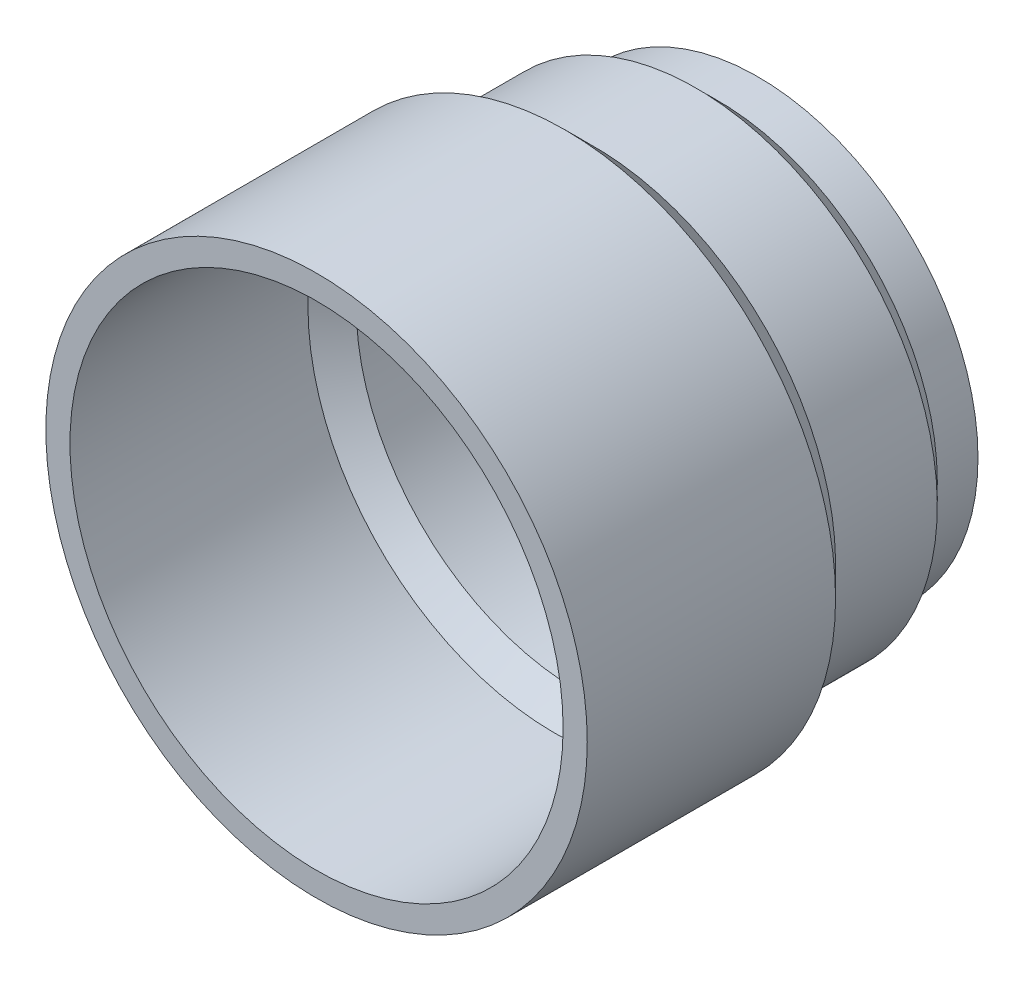
ISO-10303-21;
HEADER;
FILE_DESCRIPTION(('STEP AP214'),'2;1');
FILE_NAME('part.step','',(''),(''),'','','');
FILE_SCHEMA(('AUTOMOTIVE_DESIGN { 1 0 10303 214 1 1 1 1 }'));
ENDSEC;
DATA;
#1=APPLICATION_CONTEXT('core data for automotive mechanical design processes');
#2=APPLICATION_PROTOCOL_DEFINITION('international standard','automotive_design',2000,#1);
#3=PRODUCT_CONTEXT('',#1,'mechanical');
#4=PRODUCT('Part','Part','',(#3));
#5=PRODUCT_RELATED_PRODUCT_CATEGORY('part','',(#4));
#6=PRODUCT_DEFINITION_FORMATION('','',#4);
#7=PRODUCT_DEFINITION_CONTEXT('part definition',#1,'design');
#8=PRODUCT_DEFINITION('design','',#6,#7);
#9=PRODUCT_DEFINITION_SHAPE('','',#8);
#10=(LENGTH_UNIT() NAMED_UNIT(*) SI_UNIT(.MILLI.,.METRE.));
#11=(NAMED_UNIT(*) PLANE_ANGLE_UNIT() SI_UNIT($,.RADIAN.));
#12=(NAMED_UNIT(*) SI_UNIT($,.STERADIAN.) SOLID_ANGLE_UNIT());
#13=UNCERTAINTY_MEASURE_WITH_UNIT(LENGTH_MEASURE(1.E-05),#10,'distance_accuracy_value','');
#14=(GEOMETRIC_REPRESENTATION_CONTEXT(3) GLOBAL_UNCERTAINTY_ASSIGNED_CONTEXT((#13)) GLOBAL_UNIT_ASSIGNED_CONTEXT((#10,
#11,#12)) REPRESENTATION_CONTEXT('',''));
#15=CARTESIAN_POINT('',(0.,0.,0.));
#16=DIRECTION('',(0.,0.,1.));
#17=DIRECTION('',(1.,0.,0.));
#18=AXIS2_PLACEMENT_3D('',#15,#16,#17);
#19=CARTESIAN_POINT('',(0.,125.,67.3934));
#20=DIRECTION('',(0.,0.,1.));
#21=DIRECTION('',(1.,0.,0.));
#22=AXIS2_PLACEMENT_3D('',#19,#20,#21);
#23=CYLINDRICAL_SURFACE('',#22,3.50000000000002);
#24=CARTESIAN_POINT('',(0.,125.,67.393399999999));
#25=DIRECTION('',(0.,0.,1.));
#26=DIRECTION('',(0.,-1.,0.));
#27=AXIS2_PLACEMENT_3D('',#24,#25,#26);
#28=CIRCLE('',#27,3.49999999997096);
#29=CARTESIAN_POINT('',(0.,121.500000000029,67.393399999999));
#30=VERTEX_POINT('',#29);
#31=EDGE_CURVE('E41',#30,#30,#28,.T.);
#32=ORIENTED_EDGE('',*,*,#31,.T.);
#33=EDGE_LOOP('',(#32));
#34=FACE_BOUND('',#33,.T.);
#35=CARTESIAN_POINT('',(0.,125.,68.8684000000011));
#36=DIRECTION('',(0.,0.,1.));
#37=DIRECTION('',(0.,-1.,0.));
#38=AXIS2_PLACEMENT_3D('',#35,#36,#37);
#39=CIRCLE('',#38,3.50000000002962);
#40=CARTESIAN_POINT('',(0.,121.49999999997,68.8684000000011));
#41=VERTEX_POINT('',#40);
#42=EDGE_CURVE('E38',#41,#41,#39,.F.);
#43=ORIENTED_EDGE('',*,*,#42,.T.);
#44=EDGE_LOOP('',(#43));
#45=FACE_BOUND('',#44,.T.);
#46=ADVANCED_FACE('F14',(#34,#45),#23,.T.);
#47=CARTESIAN_POINT('',(0.,125.,67.0834000000011));
#48=DIRECTION('',(0.,0.,1.));
#49=DIRECTION('',(1.,0.,0.));
#50=AXIS2_PLACEMENT_3D('',#47,#48,#49);
#51=CONICAL_SURFACE('',#50,3.19000000002911,0.785398163307064);
#52=ORIENTED_EDGE('',*,*,#31,.F.);
#53=EDGE_LOOP('',(#52));
#54=FACE_BOUND('',#53,.T.);
#55=CARTESIAN_POINT('',(0.,125.,67.083399999997));
#56=DIRECTION('',(0.,0.,1.));
#57=DIRECTION('',(0.,-1.,0.));
#58=AXIS2_PLACEMENT_3D('',#55,#56,#57);
#59=CIRCLE('',#58,3.19);
#60=CARTESIAN_POINT('',(0.,121.81,67.083399999997));
#61=VERTEX_POINT('',#60);
#62=EDGE_CURVE('E35',#61,#61,#59,.T.);
#63=ORIENTED_EDGE('',*,*,#62,.T.);
#64=EDGE_LOOP('',(#63));
#65=FACE_BOUND('',#64,.T.);
#66=ADVANCED_FACE('F108',(#54,#65),#51,.T.);
#67=CARTESIAN_POINT('',(0.,125.,68.8684000000011));
#68=DIRECTION('',(0.,0.,1.));
#69=DIRECTION('',(1.,0.,0.));
#70=AXIS2_PLACEMENT_3D('',#67,#68,#69);
#71=CONICAL_SURFACE('',#70,3.50000000002962,0.785398163330296);
#72=ORIENTED_EDGE('',*,*,#42,.F.);
#73=EDGE_LOOP('',(#72));
#74=FACE_BOUND('',#73,.T.);
#75=CARTESIAN_POINT('',(0.,125.,69.2934));
#76=DIRECTION('',(0.,0.,1.));
#77=DIRECTION('',(0.,-1.,0.));
#78=AXIS2_PLACEMENT_3D('',#75,#76,#77);
#79=CIRCLE('',#78,3.925);
#80=CARTESIAN_POINT('',(0.,121.075,69.2934));
#81=VERTEX_POINT('',#80);
#82=EDGE_CURVE('E32',#81,#81,#79,.F.);
#83=ORIENTED_EDGE('',*,*,#82,.T.);
#84=EDGE_LOOP('',(#83));
#85=FACE_BOUND('',#84,.T.);
#86=ADVANCED_FACE('F104',(#74,#85),#71,.T.);
#87=CARTESIAN_POINT('',(0.,125.,66.493400000003));
#88=DIRECTION('',(0.,0.,1.));
#89=DIRECTION('',(1.,0.,0.));
#90=AXIS2_PLACEMENT_3D('',#87,#88,#89);
#91=CYLINDRICAL_SURFACE('',#90,3.19);
#92=ORIENTED_EDGE('',*,*,#62,.F.);
#93=EDGE_LOOP('',(#92));
#94=FACE_BOUND('',#93,.T.);
#95=CARTESIAN_POINT('',(0.,125.,66.493400000003));
#96=DIRECTION('',(0.,0.,1.));
#97=DIRECTION('',(1.,0.,0.));
#98=AXIS2_PLACEMENT_3D('',#95,#96,#97);
#99=CIRCLE('',#98,3.19);
#100=CARTESIAN_POINT('',(3.19,125.,66.493400000003));
#101=VERTEX_POINT('',#100);
#102=EDGE_CURVE('E18',#101,#101,#99,.T.);
#103=ORIENTED_EDGE('',*,*,#102,.T.);
#104=EDGE_LOOP('',(#103));
#105=FACE_BOUND('',#104,.T.);
#106=ADVANCED_FACE('F61',(#94,#105),#91,.T.);
#107=CARTESIAN_POINT('',(0.,125.,69.2934));
#108=DIRECTION('',(0.,0.,1.));
#109=DIRECTION('',(1.,0.,0.));
#110=AXIS2_PLACEMENT_3D('',#107,#108,#109);
#111=CYLINDRICAL_SURFACE('',#110,3.925);
#112=ORIENTED_EDGE('',*,*,#82,.F.);
#113=EDGE_LOOP('',(#112));
#114=FACE_BOUND('',#113,.T.);
#115=CARTESIAN_POINT('',(0.,125.,72.8933999999999));
#116=DIRECTION('',(0.,0.,1.));
#117=DIRECTION('',(1.,0.,0.));
#118=AXIS2_PLACEMENT_3D('',#115,#116,#117);
#119=CIRCLE('',#118,3.925);
#120=CARTESIAN_POINT('',(3.925,125.,72.8933999999999));
#121=VERTEX_POINT('',#120);
#122=EDGE_CURVE('E54',#121,#121,#119,.T.);
#123=ORIENTED_EDGE('',*,*,#122,.F.);
#124=EDGE_LOOP('',(#123));
#125=FACE_BOUND('',#124,.T.);
#126=ADVANCED_FACE('F66',(#114,#125),#111,.T.);
#127=CARTESIAN_POINT('',(-3.319885096314,128.3176,66.4934));
#128=DIRECTION('',(0.,0.,1.));
#129=DIRECTION('',(0.,-1.,0.));
#130=AXIS2_PLACEMENT_3D('',#127,#128,#129);
#131=PLANE('',#130);
#132=CARTESIAN_POINT('',(0.,125.,66.4934));
#133=DIRECTION('',(0.,0.,1.));
#134=DIRECTION('',(1.,0.,0.));
#135=AXIS2_PLACEMENT_3D('',#132,#133,#134);
#136=CIRCLE('',#135,0.799999999999995);
#137=CARTESIAN_POINT('',(0.799999999999995,125.,66.4934));
#138=VERTEX_POINT('',#137);
#139=EDGE_CURVE('E52',#138,#138,#136,.F.);
#140=ORIENTED_EDGE('',*,*,#139,.F.);
#141=EDGE_LOOP('',(#140));
#142=FACE_BOUND('',#141,.T.);
#143=ORIENTED_EDGE('',*,*,#102,.F.);
#144=EDGE_LOOP('',(#143));
#145=FACE_BOUND('',#144,.T.);
#146=ADVANCED_FACE('F63',(#142,#145),#131,.F.);
#147=CARTESIAN_POINT('',(-4.084385494489,129.082,72.8934));
#148=DIRECTION('',(0.,0.,1.));
#149=DIRECTION('',(0.,-1.,0.));
#150=AXIS2_PLACEMENT_3D('',#147,#148,#149);
#151=PLANE('',#150);
#152=CARTESIAN_POINT('',(0.,125.,72.8933999999999));
#153=DIRECTION('',(0.,0.,1.));
#154=DIRECTION('',(1.,0.,0.));
#155=AXIS2_PLACEMENT_3D('',#152,#153,#154);
#156=CIRCLE('',#155,3.57499999999997);
#157=CARTESIAN_POINT('',(3.57499999999997,125.,72.8933999999999));
#158=VERTEX_POINT('',#157);
#159=EDGE_CURVE('E49',#158,#158,#156,.T.);
#160=ORIENTED_EDGE('',*,*,#159,.F.);
#161=EDGE_LOOP('',(#160));
#162=FACE_BOUND('',#161,.T.);
#163=ORIENTED_EDGE('',*,*,#122,.T.);
#164=EDGE_LOOP('',(#163));
#165=FACE_BOUND('',#164,.T.);
#166=ADVANCED_FACE('F65',(#162,#165),#151,.T.);
#167=CARTESIAN_POINT('',(0.,125.,66.4934));
#168=DIRECTION('',(0.,0.,1.));
#169=DIRECTION('',(1.,0.,0.));
#170=AXIS2_PLACEMENT_3D('',#167,#168,#169);
#171=CYLINDRICAL_SURFACE('',#170,0.799999999999995);
#172=CARTESIAN_POINT('',(0.,125.,67.4934));
#173=DIRECTION('',(0.,0.,1.));
#174=DIRECTION('',(1.,0.,0.));
#175=AXIS2_PLACEMENT_3D('',#172,#173,#174);
#176=CIRCLE('',#175,0.799999999999995);
#177=CARTESIAN_POINT('',(0.799999999999995,125.,67.4934));
#178=VERTEX_POINT('',#177);
#179=EDGE_CURVE('E46',#178,#178,#176,.F.);
#180=ORIENTED_EDGE('',*,*,#179,.F.);
#181=EDGE_LOOP('',(#180));
#182=FACE_BOUND('',#181,.T.);
#183=ORIENTED_EDGE('',*,*,#139,.T.);
#184=EDGE_LOOP('',(#183));
#185=FACE_BOUND('',#184,.T.);
#186=ADVANCED_FACE('F74',(#182,#185),#171,.F.);
#187=CARTESIAN_POINT('',(0.,125.,69.4434));
#188=DIRECTION('',(0.,0.,1.));
#189=DIRECTION('',(1.,0.,0.));
#190=AXIS2_PLACEMENT_3D('',#187,#188,#189);
#191=CYLINDRICAL_SURFACE('',#190,3.57499999999997);
#192=ORIENTED_EDGE('',*,*,#159,.T.);
#193=EDGE_LOOP('',(#192));
#194=FACE_BOUND('',#193,.T.);
#195=CARTESIAN_POINT('',(0.,125.,69.4433999999989));
#196=DIRECTION('',(0.,0.,1.));
#197=DIRECTION('',(0.,-1.,0.));
#198=AXIS2_PLACEMENT_3D('',#195,#196,#197);
#199=CIRCLE('',#198,3.57499999997071);
#200=CARTESIAN_POINT('',(0.,121.425000000029,69.4433999999989));
#201=VERTEX_POINT('',#200);
#202=EDGE_CURVE('E30',#201,#201,#199,.T.);
#203=ORIENTED_EDGE('',*,*,#202,.F.);
#204=EDGE_LOOP('',(#203));
#205=FACE_BOUND('',#204,.T.);
#206=ADVANCED_FACE('F95',(#194,#205),#191,.F.);
#207=CARTESIAN_POINT('',(-3.094,128.094,67.4934));
#208=DIRECTION('',(0.,0.,1.));
#209=DIRECTION('',(0.,-1.,0.));
#210=AXIS2_PLACEMENT_3D('',#207,#208,#209);
#211=PLANE('',#210);
#212=ORIENTED_EDGE('',*,*,#179,.T.);
#213=EDGE_LOOP('',(#212));
#214=FACE_BOUND('',#213,.T.);
#215=CARTESIAN_POINT('',(0.,125.,67.493400000001));
#216=DIRECTION('',(0.,0.,1.));
#217=DIRECTION('',(1.,0.,0.));
#218=AXIS2_PLACEMENT_3D('',#215,#216,#217);
#219=CIRCLE('',#218,2.97500000002864);
#220=CARTESIAN_POINT('',(2.97500000002864,125.,67.493400000001));
#221=VERTEX_POINT('',#220);
#222=EDGE_CURVE('E27',#221,#221,#219,.F.);
#223=ORIENTED_EDGE('',*,*,#222,.F.);
#224=EDGE_LOOP('',(#223));
#225=FACE_BOUND('',#224,.T.);
#226=ADVANCED_FACE('F16',(#214,#225),#211,.T.);
#227=CARTESIAN_POINT('',(0.,125.,69.0934000000011));
#228=DIRECTION('',(0.,0.,1.));
#229=DIRECTION('',(1.,0.,0.));
#230=AXIS2_PLACEMENT_3D('',#227,#228,#229);
#231=CONICAL_SURFACE('',#230,3.22500000002933,0.785398163316739);
#232=CARTESIAN_POINT('',(0.,125.,69.0934));
#233=DIRECTION('',(0.,0.,1.));
#234=DIRECTION('',(0.,-1.,0.));
#235=AXIS2_PLACEMENT_3D('',#232,#233,#234);
#236=CIRCLE('',#235,3.22500000000001);
#237=CARTESIAN_POINT('',(0.,121.775,69.0934));
#238=VERTEX_POINT('',#237);
#239=EDGE_CURVE('E22',#238,#238,#236,.T.);
#240=ORIENTED_EDGE('',*,*,#239,.F.);
#241=EDGE_LOOP('',(#240));
#242=FACE_BOUND('',#241,.T.);
#243=ORIENTED_EDGE('',*,*,#202,.T.);
#244=EDGE_LOOP('',(#243));
#245=FACE_BOUND('',#244,.T.);
#246=ADVANCED_FACE('F87',(#242,#245),#231,.F.);
#247=CARTESIAN_POINT('',(0.,125.,67.493400000001));
#248=DIRECTION('',(0.,0.,1.));
#249=DIRECTION('',(1.,0.,0.));
#250=AXIS2_PLACEMENT_3D('',#247,#248,#249);
#251=CONICAL_SURFACE('',#250,2.97500000002864,0.785398163287148);
#252=ORIENTED_EDGE('',*,*,#222,.T.);
#253=EDGE_LOOP('',(#252));
#254=FACE_BOUND('',#253,.T.);
#255=CARTESIAN_POINT('',(0.,125.,67.7434));
#256=DIRECTION('',(0.,0.,1.));
#257=DIRECTION('',(0.,-1.,0.));
#258=AXIS2_PLACEMENT_3D('',#255,#256,#257);
#259=CIRCLE('',#258,3.22500000000001);
#260=CARTESIAN_POINT('',(0.,121.775,67.7434));
#261=VERTEX_POINT('',#260);
#262=EDGE_CURVE('E10',#261,#261,#259,.F.);
#263=ORIENTED_EDGE('',*,*,#262,.F.);
#264=EDGE_LOOP('',(#263));
#265=FACE_BOUND('',#264,.T.);
#266=ADVANCED_FACE('F82',(#254,#265),#251,.F.);
#267=CARTESIAN_POINT('',(0.,125.,67.7434));
#268=DIRECTION('',(0.,0.,1.));
#269=DIRECTION('',(1.,0.,0.));
#270=AXIS2_PLACEMENT_3D('',#267,#268,#269);
#271=CYLINDRICAL_SURFACE('',#270,3.22500000000001);
#272=ORIENTED_EDGE('',*,*,#262,.T.);
#273=EDGE_LOOP('',(#272));
#274=FACE_BOUND('',#273,.T.);
#275=ORIENTED_EDGE('',*,*,#239,.T.);
#276=EDGE_LOOP('',(#275));
#277=FACE_BOUND('',#276,.T.);
#278=ADVANCED_FACE('F80',(#274,#277),#271,.F.);
#279=CLOSED_SHELL('',(#46,#66,#86,#106,#126,#146,#166,#186,#206,#226,#246,#266,#278));
#280=MANIFOLD_SOLID_BREP('B1',#279);
#281=ADVANCED_BREP_SHAPE_REPRESENTATION('',(#18,#280),#14);
#282=SHAPE_DEFINITION_REPRESENTATION(#9,#281);
ENDSEC;
END-ISO-10303-21;
